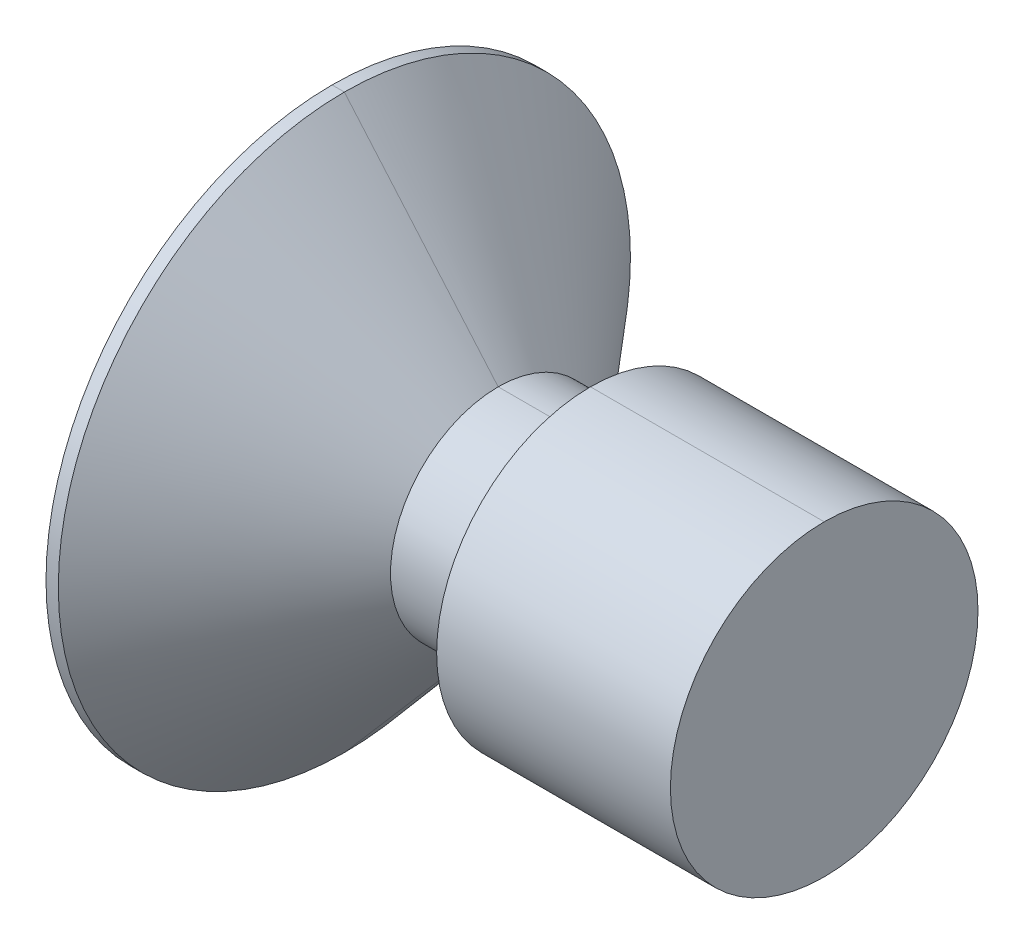
ISO-10303-21;
HEADER;
FILE_DESCRIPTION(('STEP AP214'),'2;1');
FILE_NAME('part.step','',(''),(''),'','','');
FILE_SCHEMA(('AUTOMOTIVE_DESIGN { 1 0 10303 214 1 1 1 1 }'));
ENDSEC;
DATA;
#1=APPLICATION_CONTEXT('core data for automotive mechanical design processes');
#2=APPLICATION_PROTOCOL_DEFINITION('international standard','automotive_design',2000,#1);
#3=PRODUCT_CONTEXT('',#1,'mechanical');
#4=PRODUCT('Part','Part','',(#3));
#5=PRODUCT_RELATED_PRODUCT_CATEGORY('part','',(#4));
#6=PRODUCT_DEFINITION_FORMATION('','',#4);
#7=PRODUCT_DEFINITION_CONTEXT('part definition',#1,'design');
#8=PRODUCT_DEFINITION('design','',#6,#7);
#9=PRODUCT_DEFINITION_SHAPE('','',#8);
#10=(LENGTH_UNIT() NAMED_UNIT(*) SI_UNIT(.MILLI.,.METRE.));
#11=(NAMED_UNIT(*) PLANE_ANGLE_UNIT() SI_UNIT($,.RADIAN.));
#12=(NAMED_UNIT(*) SI_UNIT($,.STERADIAN.) SOLID_ANGLE_UNIT());
#13=UNCERTAINTY_MEASURE_WITH_UNIT(LENGTH_MEASURE(1.E-05),#10,'distance_accuracy_value','');
#14=(GEOMETRIC_REPRESENTATION_CONTEXT(3) GLOBAL_UNCERTAINTY_ASSIGNED_CONTEXT((#13)) GLOBAL_UNIT_ASSIGNED_CONTEXT((#10,
#11,#12)) REPRESENTATION_CONTEXT('',''));
#15=CARTESIAN_POINT('',(0.,0.,0.));
#16=DIRECTION('',(0.,0.,1.));
#17=DIRECTION('',(1.,0.,0.));
#18=AXIS2_PLACEMENT_3D('',#15,#16,#17);
#19=CARTESIAN_POINT('',(-6.65,1.125,-1.125));
#20=DIRECTION('',(1.,0.,0.));
#21=DIRECTION('',(0.,1.,0.));
#22=AXIS2_PLACEMENT_3D('',#19,#20,#21);
#23=PLANE('',#22);
#24=DIRECTION('',(0.,-1.,0.));
#25=VECTOR('',#24,1.);
#26=CARTESIAN_POINT('',(-6.65,3.,-0.625));
#27=LINE('',#26,#25);
#28=CARTESIAN_POINT('',(-6.65,3.,-0.625));
#29=VERTEX_POINT('',#28);
#30=CARTESIAN_POINT('',(-6.65,1.125,-0.625));
#31=VERTEX_POINT('',#30);
#32=EDGE_CURVE('E279',#29,#31,#27,.T.);
#33=ORIENTED_EDGE('',*,*,#32,.T.);
#34=CARTESIAN_POINT('',(-6.65,1.125,-1.125));
#35=DIRECTION('',(1.,0.,0.));
#36=DIRECTION('',(0.,1.,0.));
#37=AXIS2_PLACEMENT_3D('',#34,#35,#36);
#38=CIRCLE('',#37,0.5);
#39=CARTESIAN_POINT('',(-6.65,0.625,-1.125));
#40=VERTEX_POINT('',#39);
#41=EDGE_CURVE('E10',#31,#40,#38,.T.);
#42=ORIENTED_EDGE('',*,*,#41,.T.);
#43=DIRECTION('',(0.,0.,-1.));
#44=VECTOR('',#43,1.);
#45=CARTESIAN_POINT('',(-6.65,0.625,-3.));
#46=LINE('',#45,#44);
#47=CARTESIAN_POINT('',(-6.65,0.625,-3.));
#48=VERTEX_POINT('',#47);
#49=EDGE_CURVE('E246',#40,#48,#46,.T.);
#50=ORIENTED_EDGE('',*,*,#49,.T.);
#51=DIRECTION('',(0.,-1.,0.));
#52=VECTOR('',#51,1.);
#53=CARTESIAN_POINT('',(-6.65,0.625,-3.));
#54=LINE('',#53,#52);
#55=CARTESIAN_POINT('',(-6.65,-0.625,-3.));
#56=VERTEX_POINT('',#55);
#57=EDGE_CURVE('E294',#48,#56,#54,.T.);
#58=ORIENTED_EDGE('',*,*,#57,.T.);
#59=DIRECTION('',(0.,0.,1.));
#60=VECTOR('',#59,1.);
#61=CARTESIAN_POINT('',(-6.65,-0.625,-3.));
#62=LINE('',#61,#60);
#63=CARTESIAN_POINT('',(-6.65,-0.625,-1.125));
#64=VERTEX_POINT('',#63);
#65=EDGE_CURVE('E283',#56,#64,#62,.T.);
#66=ORIENTED_EDGE('',*,*,#65,.T.);
#67=CARTESIAN_POINT('',(-6.65,-1.125,-1.125));
#68=DIRECTION('',(1.,0.,0.));
#69=DIRECTION('',(0.,-1.,0.));
#70=AXIS2_PLACEMENT_3D('',#67,#68,#69);
#71=CIRCLE('',#70,0.5);
#72=CARTESIAN_POINT('',(-6.65,-1.125,-0.625));
#73=VERTEX_POINT('',#72);
#74=EDGE_CURVE('E247',#64,#73,#71,.T.);
#75=ORIENTED_EDGE('',*,*,#74,.T.);
#76=DIRECTION('',(0.,-1.,0.));
#77=VECTOR('',#76,1.);
#78=CARTESIAN_POINT('',(-6.65,-1.125,-0.625));
#79=LINE('',#78,#77);
#80=CARTESIAN_POINT('',(-6.65,-3.,-0.625));
#81=VERTEX_POINT('',#80);
#82=EDGE_CURVE('E20',#73,#81,#79,.T.);
#83=ORIENTED_EDGE('',*,*,#82,.T.);
#84=DIRECTION('',(0.,0.,1.));
#85=VECTOR('',#84,1.);
#86=CARTESIAN_POINT('',(-6.65,-3.,-0.625));
#87=LINE('',#86,#85);
#88=CARTESIAN_POINT('',(-6.65,-3.,0.625));
#89=VERTEX_POINT('',#88);
#90=EDGE_CURVE('E371',#81,#89,#87,.T.);
#91=ORIENTED_EDGE('',*,*,#90,.T.);
#92=DIRECTION('',(0.,1.,0.));
#93=VECTOR('',#92,1.);
#94=CARTESIAN_POINT('',(-6.65,-1.125,0.625));
#95=LINE('',#94,#93);
#96=CARTESIAN_POINT('',(-6.65,-1.125,0.625));
#97=VERTEX_POINT('',#96);
#98=EDGE_CURVE('E313',#89,#97,#95,.T.);
#99=ORIENTED_EDGE('',*,*,#98,.T.);
#100=CARTESIAN_POINT('',(-6.65,-1.125,1.125));
#101=DIRECTION('',(1.,0.,0.));
#102=DIRECTION('',(0.,1.,0.));
#103=AXIS2_PLACEMENT_3D('',#100,#101,#102);
#104=CIRCLE('',#103,0.5);
#105=CARTESIAN_POINT('',(-6.65,-0.625,1.125));
#106=VERTEX_POINT('',#105);
#107=EDGE_CURVE('E254',#97,#106,#104,.T.);
#108=ORIENTED_EDGE('',*,*,#107,.T.);
#109=DIRECTION('',(0.,0.,1.));
#110=VECTOR('',#109,1.);
#111=CARTESIAN_POINT('',(-6.65,-0.625,1.125));
#112=LINE('',#111,#110);
#113=CARTESIAN_POINT('',(-6.65,-0.625,3.));
#114=VERTEX_POINT('',#113);
#115=EDGE_CURVE('E328',#106,#114,#112,.T.);
#116=ORIENTED_EDGE('',*,*,#115,.T.);
#117=DIRECTION('',(0.,1.,0.));
#118=VECTOR('',#117,1.);
#119=CARTESIAN_POINT('',(-6.65,0.625,3.));
#120=LINE('',#119,#118);
#121=CARTESIAN_POINT('',(-6.65,0.625,3.));
#122=VERTEX_POINT('',#121);
#123=EDGE_CURVE('E264',#114,#122,#120,.T.);
#124=ORIENTED_EDGE('',*,*,#123,.T.);
#125=DIRECTION('',(0.,0.,-1.));
#126=VECTOR('',#125,1.);
#127=CARTESIAN_POINT('',(-6.65,0.625,1.125));
#128=LINE('',#127,#126);
#129=CARTESIAN_POINT('',(-6.65,0.625,1.125));
#130=VERTEX_POINT('',#129);
#131=EDGE_CURVE('E226',#122,#130,#128,.T.);
#132=ORIENTED_EDGE('',*,*,#131,.T.);
#133=CARTESIAN_POINT('',(-6.65,1.125,1.125));
#134=DIRECTION('',(1.,0.,0.));
#135=DIRECTION('',(0.,1.,0.));
#136=AXIS2_PLACEMENT_3D('',#133,#134,#135);
#137=CIRCLE('',#136,0.5);
#138=CARTESIAN_POINT('',(-6.65,1.125,0.625));
#139=VERTEX_POINT('',#138);
#140=EDGE_CURVE('E227',#130,#139,#137,.T.);
#141=ORIENTED_EDGE('',*,*,#140,.T.);
#142=DIRECTION('',(0.,1.,0.));
#143=VECTOR('',#142,1.);
#144=CARTESIAN_POINT('',(-6.65,3.,0.625));
#145=LINE('',#144,#143);
#146=CARTESIAN_POINT('',(-6.65,3.,0.625));
#147=VERTEX_POINT('',#146);
#148=EDGE_CURVE('E344',#139,#147,#145,.T.);
#149=ORIENTED_EDGE('',*,*,#148,.T.);
#150=DIRECTION('',(0.,0.,-1.));
#151=VECTOR('',#150,1.);
#152=CARTESIAN_POINT('',(-6.65,3.,-0.625));
#153=LINE('',#152,#151);
#154=EDGE_CURVE('E278',#147,#29,#153,.T.);
#155=ORIENTED_EDGE('',*,*,#154,.T.);
#156=EDGE_LOOP('',(#33,#42,#50,#58,#66,#75,#83,#91,#99,#108,#116,#124,#132,#141,#149,#155));
#157=FACE_BOUND('',#156,.T.);
#158=ADVANCED_FACE('F16',(#157),#23,.F.);
#159=CARTESIAN_POINT('',(-6.65,1.125,-1.125));
#160=DIRECTION('',(-1.,0.,0.));
#161=DIRECTION('',(0.,-1.,0.));
#162=AXIS2_PLACEMENT_3D('',#159,#160,#161);
#163=CYLINDRICAL_SURFACE('',#162,0.5);
#164=CARTESIAN_POINT('',(-8.,1.125,-1.125));
#165=DIRECTION('',(1.,0.,0.));
#166=DIRECTION('',(0.,1.,0.));
#167=AXIS2_PLACEMENT_3D('',#164,#165,#166);
#168=CIRCLE('',#167,0.5);
#169=CARTESIAN_POINT('',(-8.,1.125,-0.625));
#170=VERTEX_POINT('',#169);
#171=CARTESIAN_POINT('',(-8.,0.625,-1.125));
#172=VERTEX_POINT('',#171);
#173=EDGE_CURVE('E389',#170,#172,#168,.T.);
#174=ORIENTED_EDGE('',*,*,#173,.T.);
#175=DIRECTION('',(-1.,0.,0.));
#176=VECTOR('',#175,1.);
#177=CARTESIAN_POINT('',(-6.65,0.625,-1.125));
#178=LINE('',#177,#176);
#179=EDGE_CURVE('E27',#40,#172,#178,.T.);
#180=ORIENTED_EDGE('',*,*,#179,.F.);
#181=ORIENTED_EDGE('',*,*,#41,.F.);
#182=DIRECTION('',(-1.,0.,0.));
#183=VECTOR('',#182,1.);
#184=CARTESIAN_POINT('',(-6.65,1.125,-0.625));
#185=LINE('',#184,#183);
#186=EDGE_CURVE('E393',#31,#170,#185,.T.);
#187=ORIENTED_EDGE('',*,*,#186,.T.);
#188=EDGE_LOOP('',(#174,#180,#181,#187));
#189=FACE_BOUND('',#188,.T.);
#190=ADVANCED_FACE('F509',(#189),#163,.T.);
#191=CARTESIAN_POINT('',(-6.65,0.625,-3.));
#192=DIRECTION('',(0.,1.,0.));
#193=DIRECTION('',(1.,0.,0.));
#194=AXIS2_PLACEMENT_3D('',#191,#192,#193);
#195=PLANE('',#194);
#196=DIRECTION('',(0.,0.,-1.));
#197=VECTOR('',#196,1.);
#198=CARTESIAN_POINT('',(-8.,0.625,-3.));
#199=LINE('',#198,#197);
#200=CARTESIAN_POINT('',(-8.,0.625,-3.));
#201=VERTEX_POINT('',#200);
#202=EDGE_CURVE('E385',#172,#201,#199,.T.);
#203=ORIENTED_EDGE('',*,*,#202,.T.);
#204=DIRECTION('',(-1.,0.,0.));
#205=VECTOR('',#204,1.);
#206=CARTESIAN_POINT('',(-6.65,0.625,-3.));
#207=LINE('',#206,#205);
#208=EDGE_CURVE('E291',#48,#201,#207,.T.);
#209=ORIENTED_EDGE('',*,*,#208,.F.);
#210=ORIENTED_EDGE('',*,*,#49,.F.);
#211=ORIENTED_EDGE('',*,*,#179,.T.);
#212=EDGE_LOOP('',(#203,#209,#210,#211));
#213=FACE_BOUND('',#212,.T.);
#214=ADVANCED_FACE('F437',(#213),#195,.F.);
#215=CARTESIAN_POINT('',(-6.65,0.625,-3.));
#216=DIRECTION('',(0.,0.,-1.));
#217=DIRECTION('',(-1.,0.,0.));
#218=AXIS2_PLACEMENT_3D('',#215,#216,#217);
#219=PLANE('',#218);
#220=DIRECTION('',(0.,-1.,0.));
#221=VECTOR('',#220,1.);
#222=CARTESIAN_POINT('',(-8.,0.625,-3.));
#223=LINE('',#222,#221);
#224=CARTESIAN_POINT('',(-8.,-0.625,-3.));
#225=VERTEX_POINT('',#224);
#226=EDGE_CURVE('E335',#201,#225,#223,.T.);
#227=ORIENTED_EDGE('',*,*,#226,.T.);
#228=DIRECTION('',(-1.,0.,0.));
#229=VECTOR('',#228,1.);
#230=CARTESIAN_POINT('',(-6.65,-0.625,-3.));
#231=LINE('',#230,#229);
#232=EDGE_CURVE('E286',#56,#225,#231,.T.);
#233=ORIENTED_EDGE('',*,*,#232,.F.);
#234=ORIENTED_EDGE('',*,*,#57,.F.);
#235=ORIENTED_EDGE('',*,*,#208,.T.);
#236=EDGE_LOOP('',(#227,#233,#234,#235));
#237=FACE_BOUND('',#236,.T.);
#238=ADVANCED_FACE('F451',(#237),#219,.F.);
#239=CARTESIAN_POINT('',(-6.65,-0.625,-3.));
#240=DIRECTION('',(0.,-1.,0.));
#241=DIRECTION('',(0.,0.,-1.));
#242=AXIS2_PLACEMENT_3D('',#239,#240,#241);
#243=PLANE('',#242);
#244=DIRECTION('',(0.,0.,1.));
#245=VECTOR('',#244,1.);
#246=CARTESIAN_POINT('',(-8.,-0.625,-3.));
#247=LINE('',#246,#245);
#248=CARTESIAN_POINT('',(-8.,-0.625,-1.125));
#249=VERTEX_POINT('',#248);
#250=EDGE_CURVE('E324',#225,#249,#247,.T.);
#251=ORIENTED_EDGE('',*,*,#250,.T.);
#252=DIRECTION('',(-1.,0.,0.));
#253=VECTOR('',#252,1.);
#254=CARTESIAN_POINT('',(-6.65,-0.625,-1.125));
#255=LINE('',#254,#253);
#256=EDGE_CURVE('E250',#64,#249,#255,.T.);
#257=ORIENTED_EDGE('',*,*,#256,.F.);
#258=ORIENTED_EDGE('',*,*,#65,.F.);
#259=ORIENTED_EDGE('',*,*,#232,.T.);
#260=EDGE_LOOP('',(#251,#257,#258,#259));
#261=FACE_BOUND('',#260,.T.);
#262=ADVANCED_FACE('F591',(#261),#243,.F.);
#263=CARTESIAN_POINT('',(-6.65,-1.125,-1.125));
#264=DIRECTION('',(-1.,0.,0.));
#265=DIRECTION('',(0.,-1.,0.));
#266=AXIS2_PLACEMENT_3D('',#263,#264,#265);
#267=CYLINDRICAL_SURFACE('',#266,0.5);
#268=CARTESIAN_POINT('',(-8.,-1.125,-1.125));
#269=DIRECTION('',(1.,0.,0.));
#270=DIRECTION('',(0.,-1.,0.));
#271=AXIS2_PLACEMENT_3D('',#268,#269,#270);
#272=CIRCLE('',#271,0.5);
#273=CARTESIAN_POINT('',(-8.,-1.125,-0.625));
#274=VERTEX_POINT('',#273);
#275=EDGE_CURVE('E320',#249,#274,#272,.T.);
#276=ORIENTED_EDGE('',*,*,#275,.T.);
#277=DIRECTION('',(-1.,0.,0.));
#278=VECTOR('',#277,1.);
#279=CARTESIAN_POINT('',(-6.65,-1.125,-0.625));
#280=LINE('',#279,#278);
#281=EDGE_CURVE('E251',#73,#274,#280,.T.);
#282=ORIENTED_EDGE('',*,*,#281,.F.);
#283=ORIENTED_EDGE('',*,*,#74,.F.);
#284=ORIENTED_EDGE('',*,*,#256,.T.);
#285=EDGE_LOOP('',(#276,#282,#283,#284));
#286=FACE_BOUND('',#285,.T.);
#287=ADVANCED_FACE('F539',(#286),#267,.T.);
#288=CARTESIAN_POINT('',(-6.65,-1.125,-0.625));
#289=DIRECTION('',(0.,0.,-1.));
#290=DIRECTION('',(0.,-1.,0.));
#291=AXIS2_PLACEMENT_3D('',#288,#289,#290);
#292=PLANE('',#291);
#293=DIRECTION('',(0.,-1.,0.));
#294=VECTOR('',#293,1.);
#295=CARTESIAN_POINT('',(-8.,-1.125,-0.625));
#296=LINE('',#295,#294);
#297=CARTESIAN_POINT('',(-8.,-3.,-0.625));
#298=VERTEX_POINT('',#297);
#299=EDGE_CURVE('E305',#274,#298,#296,.T.);
#300=ORIENTED_EDGE('',*,*,#299,.T.);
#301=DIRECTION('',(-1.,0.,0.));
#302=VECTOR('',#301,1.);
#303=CARTESIAN_POINT('',(-6.65,-3.,-0.625));
#304=LINE('',#303,#302);
#305=EDGE_CURVE('E375',#81,#298,#304,.T.);
#306=ORIENTED_EDGE('',*,*,#305,.F.);
#307=ORIENTED_EDGE('',*,*,#82,.F.);
#308=ORIENTED_EDGE('',*,*,#281,.T.);
#309=EDGE_LOOP('',(#300,#306,#307,#308));
#310=FACE_BOUND('',#309,.T.);
#311=ADVANCED_FACE('F537',(#310),#292,.F.);
#312=CARTESIAN_POINT('',(-6.65,-3.,-0.625));
#313=DIRECTION('',(0.,-1.,0.));
#314=DIRECTION('',(0.,0.,-1.));
#315=AXIS2_PLACEMENT_3D('',#312,#313,#314);
#316=PLANE('',#315);
#317=DIRECTION('',(0.,0.,1.));
#318=VECTOR('',#317,1.);
#319=CARTESIAN_POINT('',(-8.,-3.,-0.625));
#320=LINE('',#319,#318);
#321=CARTESIAN_POINT('',(-8.,-3.,0.625));
#322=VERTEX_POINT('',#321);
#323=EDGE_CURVE('E301',#298,#322,#320,.T.);
#324=ORIENTED_EDGE('',*,*,#323,.T.);
#325=DIRECTION('',(-1.,0.,0.));
#326=VECTOR('',#325,1.);
#327=CARTESIAN_POINT('',(-6.65,-3.,0.625));
#328=LINE('',#327,#326);
#329=EDGE_CURVE('E316',#89,#322,#328,.T.);
#330=ORIENTED_EDGE('',*,*,#329,.F.);
#331=ORIENTED_EDGE('',*,*,#90,.F.);
#332=ORIENTED_EDGE('',*,*,#305,.T.);
#333=EDGE_LOOP('',(#324,#330,#331,#332));
#334=FACE_BOUND('',#333,.T.);
#335=ADVANCED_FACE('F533',(#334),#316,.F.);
#336=CARTESIAN_POINT('',(-6.65,-1.125,0.625));
#337=DIRECTION('',(0.,0.,1.));
#338=DIRECTION('',(0.,-1.,0.));
#339=AXIS2_PLACEMENT_3D('',#336,#337,#338);
#340=PLANE('',#339);
#341=DIRECTION('',(0.,1.,0.));
#342=VECTOR('',#341,1.);
#343=CARTESIAN_POINT('',(-8.,-1.125,0.625));
#344=LINE('',#343,#342);
#345=CARTESIAN_POINT('',(-8.,-1.125,0.625));
#346=VERTEX_POINT('',#345);
#347=EDGE_CURVE('E240',#322,#346,#344,.T.);
#348=ORIENTED_EDGE('',*,*,#347,.T.);
#349=DIRECTION('',(-1.,0.,0.));
#350=VECTOR('',#349,1.);
#351=CARTESIAN_POINT('',(-6.65,-1.125,0.625));
#352=LINE('',#351,#350);
#353=EDGE_CURVE('E257',#97,#346,#352,.T.);
#354=ORIENTED_EDGE('',*,*,#353,.F.);
#355=ORIENTED_EDGE('',*,*,#98,.F.);
#356=ORIENTED_EDGE('',*,*,#329,.T.);
#357=EDGE_LOOP('',(#348,#354,#355,#356));
#358=FACE_BOUND('',#357,.T.);
#359=ADVANCED_FACE('F528',(#358),#340,.F.);
#360=CARTESIAN_POINT('',(-6.65,-1.125,1.125));
#361=DIRECTION('',(-1.,0.,0.));
#362=DIRECTION('',(0.,-1.,0.));
#363=AXIS2_PLACEMENT_3D('',#360,#361,#362);
#364=CYLINDRICAL_SURFACE('',#363,0.5);
#365=CARTESIAN_POINT('',(-8.,-1.125,1.125));
#366=DIRECTION('',(1.,0.,0.));
#367=DIRECTION('',(0.,1.,0.));
#368=AXIS2_PLACEMENT_3D('',#365,#366,#367);
#369=CIRCLE('',#368,0.5);
#370=CARTESIAN_POINT('',(-8.,-0.625,1.125));
#371=VERTEX_POINT('',#370);
#372=EDGE_CURVE('E237',#346,#371,#369,.T.);
#373=ORIENTED_EDGE('',*,*,#372,.T.);
#374=DIRECTION('',(-1.,0.,0.));
#375=VECTOR('',#374,1.);
#376=CARTESIAN_POINT('',(-6.65,-0.625,1.125));
#377=LINE('',#376,#375);
#378=EDGE_CURVE('E258',#106,#371,#377,.T.);
#379=ORIENTED_EDGE('',*,*,#378,.F.);
#380=ORIENTED_EDGE('',*,*,#107,.F.);
#381=ORIENTED_EDGE('',*,*,#353,.T.);
#382=EDGE_LOOP('',(#373,#379,#380,#381));
#383=FACE_BOUND('',#382,.T.);
#384=ADVANCED_FACE('F522',(#383),#364,.T.);
#385=CARTESIAN_POINT('',(-6.65,-0.625,1.125));
#386=DIRECTION('',(0.,-1.,0.));
#387=DIRECTION('',(0.,0.,-1.));
#388=AXIS2_PLACEMENT_3D('',#385,#386,#387);
#389=PLANE('',#388);
#390=DIRECTION('',(0.,0.,1.));
#391=VECTOR('',#390,1.);
#392=CARTESIAN_POINT('',(-8.,-0.625,1.125));
#393=LINE('',#392,#391);
#394=CARTESIAN_POINT('',(-8.,-0.625,3.));
#395=VERTEX_POINT('',#394);
#396=EDGE_CURVE('E241',#371,#395,#393,.T.);
#397=ORIENTED_EDGE('',*,*,#396,.T.);
#398=DIRECTION('',(-1.,0.,0.));
#399=VECTOR('',#398,1.);
#400=CARTESIAN_POINT('',(-6.65,-0.625,3.));
#401=LINE('',#400,#399);
#402=EDGE_CURVE('E267',#114,#395,#401,.T.);
#403=ORIENTED_EDGE('',*,*,#402,.F.);
#404=ORIENTED_EDGE('',*,*,#115,.F.);
#405=ORIENTED_EDGE('',*,*,#378,.T.);
#406=EDGE_LOOP('',(#397,#403,#404,#405));
#407=FACE_BOUND('',#406,.T.);
#408=ADVANCED_FACE('F518',(#407),#389,.F.);
#409=CARTESIAN_POINT('',(-6.65,0.625,3.));
#410=DIRECTION('',(0.,0.,1.));
#411=DIRECTION('',(1.,0.,0.));
#412=AXIS2_PLACEMENT_3D('',#409,#410,#411);
#413=PLANE('',#412);
#414=DIRECTION('',(0.,1.,0.));
#415=VECTOR('',#414,1.);
#416=CARTESIAN_POINT('',(-8.,0.625,3.));
#417=LINE('',#416,#415);
#418=CARTESIAN_POINT('',(-8.,0.625,3.));
#419=VERTEX_POINT('',#418);
#420=EDGE_CURVE('E296',#395,#419,#417,.T.);
#421=ORIENTED_EDGE('',*,*,#420,.T.);
#422=DIRECTION('',(-1.,0.,0.));
#423=VECTOR('',#422,1.);
#424=CARTESIAN_POINT('',(-6.65,0.625,3.));
#425=LINE('',#424,#423);
#426=EDGE_CURVE('E268',#122,#419,#425,.T.);
#427=ORIENTED_EDGE('',*,*,#426,.F.);
#428=ORIENTED_EDGE('',*,*,#123,.F.);
#429=ORIENTED_EDGE('',*,*,#402,.T.);
#430=EDGE_LOOP('',(#421,#427,#428,#429));
#431=FACE_BOUND('',#430,.T.);
#432=ADVANCED_FACE('F514',(#431),#413,.F.);
#433=CARTESIAN_POINT('',(-6.65,0.625,1.125));
#434=DIRECTION('',(0.,1.,0.));
#435=DIRECTION('',(0.,0.,-1.));
#436=AXIS2_PLACEMENT_3D('',#433,#434,#435);
#437=PLANE('',#436);
#438=DIRECTION('',(0.,0.,-1.));
#439=VECTOR('',#438,1.);
#440=CARTESIAN_POINT('',(-8.,0.625,1.125));
#441=LINE('',#440,#439);
#442=CARTESIAN_POINT('',(-8.,0.625,1.125));
#443=VERTEX_POINT('',#442);
#444=EDGE_CURVE('E300',#419,#443,#441,.T.);
#445=ORIENTED_EDGE('',*,*,#444,.T.);
#446=DIRECTION('',(-1.,0.,0.));
#447=VECTOR('',#446,1.);
#448=CARTESIAN_POINT('',(-6.65,0.625,1.125));
#449=LINE('',#448,#447);
#450=EDGE_CURVE('E224',#130,#443,#449,.T.);
#451=ORIENTED_EDGE('',*,*,#450,.F.);
#452=ORIENTED_EDGE('',*,*,#131,.F.);
#453=ORIENTED_EDGE('',*,*,#426,.T.);
#454=EDGE_LOOP('',(#445,#451,#452,#453));
#455=FACE_BOUND('',#454,.T.);
#456=ADVANCED_FACE('F490',(#455),#437,.F.);
#457=CARTESIAN_POINT('',(-6.65,1.125,1.125));
#458=DIRECTION('',(-1.,0.,0.));
#459=DIRECTION('',(0.,-1.,0.));
#460=AXIS2_PLACEMENT_3D('',#457,#458,#459);
#461=CYLINDRICAL_SURFACE('',#460,0.5);
#462=CARTESIAN_POINT('',(-8.,1.125,1.125));
#463=DIRECTION('',(1.,0.,0.));
#464=DIRECTION('',(0.,1.,0.));
#465=AXIS2_PLACEMENT_3D('',#462,#463,#464);
#466=CIRCLE('',#465,0.5);
#467=CARTESIAN_POINT('',(-8.,1.125,0.625));
#468=VERTEX_POINT('',#467);
#469=EDGE_CURVE('E235',#443,#468,#466,.T.);
#470=ORIENTED_EDGE('',*,*,#469,.T.);
#471=DIRECTION('',(-1.,0.,0.));
#472=VECTOR('',#471,1.);
#473=CARTESIAN_POINT('',(-6.65,1.125,0.625));
#474=LINE('',#473,#472);
#475=EDGE_CURVE('E282',#139,#468,#474,.T.);
#476=ORIENTED_EDGE('',*,*,#475,.F.);
#477=ORIENTED_EDGE('',*,*,#140,.F.);
#478=ORIENTED_EDGE('',*,*,#450,.T.);
#479=EDGE_LOOP('',(#470,#476,#477,#478));
#480=FACE_BOUND('',#479,.T.);
#481=ADVANCED_FACE('F494',(#480),#461,.T.);
#482=CARTESIAN_POINT('',(-6.65,3.,0.625));
#483=DIRECTION('',(0.,0.,1.));
#484=DIRECTION('',(0.,-1.,0.));
#485=AXIS2_PLACEMENT_3D('',#482,#483,#484);
#486=PLANE('',#485);
#487=DIRECTION('',(0.,1.,0.));
#488=VECTOR('',#487,1.);
#489=CARTESIAN_POINT('',(-8.,3.,0.625));
#490=LINE('',#489,#488);
#491=CARTESIAN_POINT('',(-8.,3.,0.625));
#492=VERTEX_POINT('',#491);
#493=EDGE_CURVE('E231',#468,#492,#490,.T.);
#494=ORIENTED_EDGE('',*,*,#493,.T.);
#495=DIRECTION('',(-1.,0.,0.));
#496=VECTOR('',#495,1.);
#497=CARTESIAN_POINT('',(-6.65,3.,0.625));
#498=LINE('',#497,#496);
#499=EDGE_CURVE('E368',#147,#492,#498,.T.);
#500=ORIENTED_EDGE('',*,*,#499,.F.);
#501=ORIENTED_EDGE('',*,*,#148,.F.);
#502=ORIENTED_EDGE('',*,*,#475,.T.);
#503=EDGE_LOOP('',(#494,#500,#501,#502));
#504=FACE_BOUND('',#503,.T.);
#505=ADVANCED_FACE('F499',(#504),#486,.F.);
#506=CARTESIAN_POINT('',(-6.65,3.,-0.625));
#507=DIRECTION('',(0.,1.,0.));
#508=DIRECTION('',(1.,0.,0.));
#509=AXIS2_PLACEMENT_3D('',#506,#507,#508);
#510=PLANE('',#509);
#511=DIRECTION('',(0.,0.,-1.));
#512=VECTOR('',#511,1.);
#513=CARTESIAN_POINT('',(-8.,3.,-0.625));
#514=LINE('',#513,#512);
#515=CARTESIAN_POINT('',(-8.,3.,-0.625));
#516=VERTEX_POINT('',#515);
#517=EDGE_CURVE('E236',#492,#516,#514,.T.);
#518=ORIENTED_EDGE('',*,*,#517,.T.);
#519=DIRECTION('',(-1.,0.,0.));
#520=VECTOR('',#519,1.);
#521=CARTESIAN_POINT('',(-6.65,3.,-0.625));
#522=LINE('',#521,#520);
#523=EDGE_CURVE('E275',#29,#516,#522,.T.);
#524=ORIENTED_EDGE('',*,*,#523,.F.);
#525=ORIENTED_EDGE('',*,*,#154,.F.);
#526=ORIENTED_EDGE('',*,*,#499,.T.);
#527=EDGE_LOOP('',(#518,#524,#525,#526));
#528=FACE_BOUND('',#527,.T.);
#529=ADVANCED_FACE('F505',(#528),#510,.F.);
#530=CARTESIAN_POINT('',(-6.65,3.,-0.625));
#531=DIRECTION('',(0.,0.,-1.));
#532=DIRECTION('',(0.,-1.,0.));
#533=AXIS2_PLACEMENT_3D('',#530,#531,#532);
#534=PLANE('',#533);
#535=DIRECTION('',(0.,-1.,0.));
#536=VECTOR('',#535,1.);
#537=CARTESIAN_POINT('',(-8.,3.,-0.625));
#538=LINE('',#537,#536);
#539=EDGE_CURVE('E341',#516,#170,#538,.T.);
#540=ORIENTED_EDGE('',*,*,#539,.T.);
#541=ORIENTED_EDGE('',*,*,#186,.F.);
#542=ORIENTED_EDGE('',*,*,#32,.F.);
#543=ORIENTED_EDGE('',*,*,#523,.T.);
#544=EDGE_LOOP('',(#540,#541,#542,#543));
#545=FACE_BOUND('',#544,.T.);
#546=ADVANCED_FACE('F18',(#545),#534,.F.);
#547=CARTESIAN_POINT('',(-8.,4.65,0.));
#548=DIRECTION('',(-1.,0.,0.));
#549=DIRECTION('',(0.,1.,0.));
#550=AXIS2_PLACEMENT_3D('',#547,#548,#549);
#551=PLANE('',#550);
#552=ORIENTED_EDGE('',*,*,#539,.F.);
#553=ORIENTED_EDGE('',*,*,#517,.F.);
#554=ORIENTED_EDGE('',*,*,#493,.F.);
#555=ORIENTED_EDGE('',*,*,#469,.F.);
#556=ORIENTED_EDGE('',*,*,#444,.F.);
#557=ORIENTED_EDGE('',*,*,#420,.F.);
#558=ORIENTED_EDGE('',*,*,#396,.F.);
#559=ORIENTED_EDGE('',*,*,#372,.F.);
#560=ORIENTED_EDGE('',*,*,#347,.F.);
#561=ORIENTED_EDGE('',*,*,#323,.F.);
#562=ORIENTED_EDGE('',*,*,#299,.F.);
#563=ORIENTED_EDGE('',*,*,#275,.F.);
#564=ORIENTED_EDGE('',*,*,#250,.F.);
#565=ORIENTED_EDGE('',*,*,#226,.F.);
#566=ORIENTED_EDGE('',*,*,#202,.F.);
#567=ORIENTED_EDGE('',*,*,#173,.F.);
#568=EDGE_LOOP('',(#552,#553,#554,#555,#556,#557,#558,#559,#560,#561,#562,#563,#564,#565,#566,#567));
#569=FACE_BOUND('',#568,.T.);
#570=CARTESIAN_POINT('',(-8.,0.,0.));
#571=DIRECTION('',(1.,0.,0.));
#572=DIRECTION('',(0.,1.,0.));
#573=AXIS2_PLACEMENT_3D('',#570,#571,#572);
#574=CIRCLE('',#573,4.65);
#575=CARTESIAN_POINT('',(-8.,4.65,0.));
#576=VERTEX_POINT('',#575);
#577=CARTESIAN_POINT('',(-8.,-4.65,0.));
#578=VERTEX_POINT('',#577);
#579=EDGE_CURVE('E259',#576,#578,#574,.T.);
#580=ORIENTED_EDGE('',*,*,#579,.F.);
#581=CARTESIAN_POINT('',(-8.,0.,0.));
#582=DIRECTION('',(1.,0.,0.));
#583=DIRECTION('',(0.,1.,0.));
#584=AXIS2_PLACEMENT_3D('',#581,#582,#583);
#585=CIRCLE('',#584,4.65);
#586=EDGE_CURVE('E230',#578,#576,#585,.T.);
#587=ORIENTED_EDGE('',*,*,#586,.F.);
#588=EDGE_LOOP('',(#580,#587));
#589=FACE_BOUND('',#588,.T.);
#590=ADVANCED_FACE('F446',(#569,#589),#551,.T.);
#591=CARTESIAN_POINT('',(0.,0.,0.));
#592=DIRECTION('',(1.,0.,0.));
#593=DIRECTION('',(0.,1.,0.));
#594=AXIS2_PLACEMENT_3D('',#591,#592,#593);
#595=CYLINDRICAL_SURFACE('',#594,4.65);
#596=DIRECTION('',(1.,0.,0.));
#597=VECTOR('',#596,1.);
#598=CARTESIAN_POINT('',(0.,-4.65,0.));
#599=LINE('',#598,#597);
#600=CARTESIAN_POINT('',(-7.8,-4.65,0.));
#601=VERTEX_POINT('',#600);
#602=EDGE_CURVE('E262',#578,#601,#599,.T.);
#603=ORIENTED_EDGE('',*,*,#602,.F.);
#604=ORIENTED_EDGE('',*,*,#586,.T.);
#605=DIRECTION('',(1.,0.,0.));
#606=VECTOR('',#605,1.);
#607=CARTESIAN_POINT('',(0.,4.65,0.));
#608=LINE('',#607,#606);
#609=CARTESIAN_POINT('',(-7.8,4.65,0.));
#610=VERTEX_POINT('',#609);
#611=EDGE_CURVE('E215',#576,#610,#608,.T.);
#612=ORIENTED_EDGE('',*,*,#611,.T.);
#613=CARTESIAN_POINT('',(-7.8,0.,0.));
#614=DIRECTION('',(1.,0.,0.));
#615=DIRECTION('',(0.,1.,0.));
#616=AXIS2_PLACEMENT_3D('',#613,#614,#615);
#617=CIRCLE('',#616,4.65);
#618=EDGE_CURVE('E191',#601,#610,#617,.T.);
#619=ORIENTED_EDGE('',*,*,#618,.F.);
#620=EDGE_LOOP('',(#603,#604,#612,#619));
#621=FACE_BOUND('',#620,.T.);
#622=ADVANCED_FACE('F565',(#621),#595,.T.);
#623=CARTESIAN_POINT('',(-5.3,0.,0.));
#624=DIRECTION('',(-1.,0.,0.));
#625=DIRECTION('',(0.,-1.,0.));
#626=AXIS2_PLACEMENT_3D('',#623,#624,#625);
#627=CONICAL_SURFACE('',#626,1.75,0.859337201055389);
#628=DIRECTION('',(-0.652939622069463,0.757409961600577,0.));
#629=VECTOR('',#628,1.);
#630=CARTESIAN_POINT('',(-5.3,1.75,0.));
#631=LINE('',#630,#629);
#632=CARTESIAN_POINT('',(-5.3,1.75,0.));
#633=VERTEX_POINT('',#632);
#634=EDGE_CURVE('E205',#633,#610,#631,.T.);
#635=ORIENTED_EDGE('',*,*,#634,.F.);
#636=CARTESIAN_POINT('',(-5.3,0.,0.));
#637=DIRECTION('',(1.,0.,0.));
#638=DIRECTION('',(0.,1.,0.));
#639=AXIS2_PLACEMENT_3D('',#636,#637,#638);
#640=CIRCLE('',#639,1.75);
#641=CARTESIAN_POINT('',(-5.3,-1.75,0.));
#642=VERTEX_POINT('',#641);
#643=EDGE_CURVE('E178',#642,#633,#640,.T.);
#644=ORIENTED_EDGE('',*,*,#643,.F.);
#645=DIRECTION('',(-0.652939622069463,-0.757409961600577,0.));
#646=VECTOR('',#645,1.);
#647=CARTESIAN_POINT('',(-5.3,-1.75,0.));
#648=LINE('',#647,#646);
#649=EDGE_CURVE('E211',#642,#601,#648,.T.);
#650=ORIENTED_EDGE('',*,*,#649,.T.);
#651=ORIENTED_EDGE('',*,*,#618,.T.);
#652=EDGE_LOOP('',(#635,#644,#650,#651));
#653=FACE_BOUND('',#652,.T.);
#654=ADVANCED_FACE('F206',(#653),#627,.T.);
#655=CARTESIAN_POINT('',(0.,0.,0.));
#656=DIRECTION('',(1.,0.,0.));
#657=DIRECTION('',(0.,1.,0.));
#658=AXIS2_PLACEMENT_3D('',#655,#656,#657);
#659=CYLINDRICAL_SURFACE('',#658,1.75);
#660=DIRECTION('',(1.,0.,0.));
#661=VECTOR('',#660,1.);
#662=CARTESIAN_POINT('',(0.,-1.75,0.));
#663=LINE('',#662,#661);
#664=CARTESIAN_POINT('',(-3.8,-1.75,0.));
#665=VERTEX_POINT('',#664);
#666=EDGE_CURVE('E185',#642,#665,#663,.T.);
#667=ORIENTED_EDGE('',*,*,#666,.F.);
#668=ORIENTED_EDGE('',*,*,#643,.T.);
#669=DIRECTION('',(1.,0.,0.));
#670=VECTOR('',#669,1.);
#671=CARTESIAN_POINT('',(0.,1.75,0.));
#672=LINE('',#671,#670);
#673=CARTESIAN_POINT('',(-3.8,1.75,0.));
#674=VERTEX_POINT('',#673);
#675=EDGE_CURVE('E182',#633,#674,#672,.T.);
#676=ORIENTED_EDGE('',*,*,#675,.T.);
#677=CARTESIAN_POINT('',(-3.8,0.,0.));
#678=DIRECTION('',(1.,0.,0.));
#679=DIRECTION('',(0.,1.,0.));
#680=AXIS2_PLACEMENT_3D('',#677,#678,#679);
#681=CIRCLE('',#680,1.75);
#682=EDGE_CURVE('E192',#665,#674,#681,.T.);
#683=ORIENTED_EDGE('',*,*,#682,.F.);
#684=EDGE_LOOP('',(#667,#668,#676,#683));
#685=FACE_BOUND('',#684,.T.);
#686=ADVANCED_FACE('F180',(#685),#659,.T.);
#687=CARTESIAN_POINT('',(-3.8,2.5,0.));
#688=DIRECTION('',(-1.,0.,0.));
#689=DIRECTION('',(0.,1.,0.));
#690=AXIS2_PLACEMENT_3D('',#687,#688,#689);
#691=PLANE('',#690);
#692=CARTESIAN_POINT('',(-3.8,0.,0.));
#693=DIRECTION('',(1.,0.,0.));
#694=DIRECTION('',(0.,1.,0.));
#695=AXIS2_PLACEMENT_3D('',#692,#693,#694);
#696=CIRCLE('',#695,1.75);
#697=EDGE_CURVE('E200',#674,#665,#696,.T.);
#698=ORIENTED_EDGE('',*,*,#697,.T.);
#699=ORIENTED_EDGE('',*,*,#682,.T.);
#700=EDGE_LOOP('',(#698,#699));
#701=FACE_BOUND('',#700,.T.);
#702=CARTESIAN_POINT('',(-3.8,0.,0.));
#703=DIRECTION('',(1.,0.,0.));
#704=DIRECTION('',(0.,1.,0.));
#705=AXIS2_PLACEMENT_3D('',#702,#703,#704);
#706=CIRCLE('',#705,2.5);
#707=CARTESIAN_POINT('',(-3.8,2.5,0.));
#708=VERTEX_POINT('',#707);
#709=CARTESIAN_POINT('',(-3.8,-2.5,0.));
#710=VERTEX_POINT('',#709);
#711=EDGE_CURVE('E202',#708,#710,#706,.T.);
#712=ORIENTED_EDGE('',*,*,#711,.F.);
#713=CARTESIAN_POINT('',(-3.8,0.,0.));
#714=DIRECTION('',(1.,0.,0.));
#715=DIRECTION('',(0.,1.,0.));
#716=AXIS2_PLACEMENT_3D('',#713,#714,#715);
#717=CIRCLE('',#716,2.5);
#718=EDGE_CURVE('E290',#710,#708,#717,.T.);
#719=ORIENTED_EDGE('',*,*,#718,.F.);
#720=EDGE_LOOP('',(#712,#719));
#721=FACE_BOUND('',#720,.T.);
#722=ADVANCED_FACE('F638',(#701,#721),#691,.T.);
#723=CARTESIAN_POINT('',(0.,0.,0.));
#724=DIRECTION('',(1.,0.,0.));
#725=DIRECTION('',(0.,1.,0.));
#726=AXIS2_PLACEMENT_3D('',#723,#724,#725);
#727=CYLINDRICAL_SURFACE('',#726,2.5);
#728=DIRECTION('',(1.,0.,0.));
#729=VECTOR('',#728,1.);
#730=CARTESIAN_POINT('',(0.,-2.5,0.));
#731=LINE('',#730,#729);
#732=CARTESIAN_POINT('',(0.,-2.5,0.));
#733=VERTEX_POINT('',#732);
#734=EDGE_CURVE('E274',#710,#733,#731,.T.);
#735=ORIENTED_EDGE('',*,*,#734,.F.);
#736=ORIENTED_EDGE('',*,*,#718,.T.);
#737=DIRECTION('',(1.,0.,0.));
#738=VECTOR('',#737,1.);
#739=CARTESIAN_POINT('',(0.,2.5,0.));
#740=LINE('',#739,#738);
#741=CARTESIAN_POINT('',(0.,2.5,0.));
#742=VERTEX_POINT('',#741);
#743=EDGE_CURVE('E273',#708,#742,#740,.T.);
#744=ORIENTED_EDGE('',*,*,#743,.T.);
#745=CARTESIAN_POINT('',(0.,0.,0.));
#746=DIRECTION('',(1.,0.,0.));
#747=DIRECTION('',(0.,1.,0.));
#748=AXIS2_PLACEMENT_3D('',#745,#746,#747);
#749=CIRCLE('',#748,2.5);
#750=EDGE_CURVE('E287',#733,#742,#749,.T.);
#751=ORIENTED_EDGE('',*,*,#750,.F.);
#752=EDGE_LOOP('',(#735,#736,#744,#751));
#753=FACE_BOUND('',#752,.T.);
#754=ADVANCED_FACE('F700',(#753),#727,.T.);
#755=CARTESIAN_POINT('',(0.,0.,0.));
#756=DIRECTION('',(1.,0.,0.));
#757=DIRECTION('',(0.,1.,0.));
#758=AXIS2_PLACEMENT_3D('',#755,#756,#757);
#759=PLANE('',#758);
#760=CARTESIAN_POINT('',(0.,0.,0.));
#761=DIRECTION('',(1.,0.,0.));
#762=DIRECTION('',(0.,1.,0.));
#763=AXIS2_PLACEMENT_3D('',#760,#761,#762);
#764=CIRCLE('',#763,2.5);
#765=EDGE_CURVE('E269',#742,#733,#764,.T.);
#766=ORIENTED_EDGE('',*,*,#765,.T.);
#767=ORIENTED_EDGE('',*,*,#750,.T.);
#768=EDGE_LOOP('',(#766,#767));
#769=FACE_BOUND('',#768,.T.);
#770=ADVANCED_FACE('F626',(#769),#759,.T.);
#771=CARTESIAN_POINT('',(0.,0.,0.));
#772=DIRECTION('',(1.,0.,0.));
#773=DIRECTION('',(0.,1.,0.));
#774=AXIS2_PLACEMENT_3D('',#771,#772,#773);
#775=CYLINDRICAL_SURFACE('',#774,2.5);
#776=ORIENTED_EDGE('',*,*,#711,.T.);
#777=ORIENTED_EDGE('',*,*,#734,.T.);
#778=ORIENTED_EDGE('',*,*,#765,.F.);
#779=ORIENTED_EDGE('',*,*,#743,.F.);
#780=EDGE_LOOP('',(#776,#777,#778,#779));
#781=FACE_BOUND('',#780,.T.);
#782=ADVANCED_FACE('F578',(#781),#775,.T.);
#783=CARTESIAN_POINT('',(0.,0.,0.));
#784=DIRECTION('',(1.,0.,0.));
#785=DIRECTION('',(0.,1.,0.));
#786=AXIS2_PLACEMENT_3D('',#783,#784,#785);
#787=CYLINDRICAL_SURFACE('',#786,1.75);
#788=CARTESIAN_POINT('',(-5.3,0.,0.));
#789=DIRECTION('',(1.,0.,0.));
#790=DIRECTION('',(0.,1.,0.));
#791=AXIS2_PLACEMENT_3D('',#788,#789,#790);
#792=CIRCLE('',#791,1.75);
#793=EDGE_CURVE('E198',#633,#642,#792,.T.);
#794=ORIENTED_EDGE('',*,*,#793,.T.);
#795=ORIENTED_EDGE('',*,*,#666,.T.);
#796=ORIENTED_EDGE('',*,*,#697,.F.);
#797=ORIENTED_EDGE('',*,*,#675,.F.);
#798=EDGE_LOOP('',(#794,#795,#796,#797));
#799=FACE_BOUND('',#798,.T.);
#800=ADVANCED_FACE('F196',(#799),#787,.T.);
#801=CARTESIAN_POINT('',(-5.3,0.,0.));
#802=DIRECTION('',(-1.,0.,0.));
#803=DIRECTION('',(0.,-1.,0.));
#804=AXIS2_PLACEMENT_3D('',#801,#802,#803);
#805=CONICAL_SURFACE('',#804,1.75,0.859337201055389);
#806=ORIENTED_EDGE('',*,*,#793,.F.);
#807=ORIENTED_EDGE('',*,*,#634,.T.);
#808=CARTESIAN_POINT('',(-7.8,0.,0.));
#809=DIRECTION('',(1.,0.,0.));
#810=DIRECTION('',(0.,1.,0.));
#811=AXIS2_PLACEMENT_3D('',#808,#809,#810);
#812=CIRCLE('',#811,4.65);
#813=EDGE_CURVE('E221',#610,#601,#812,.T.);
#814=ORIENTED_EDGE('',*,*,#813,.T.);
#815=ORIENTED_EDGE('',*,*,#649,.F.);
#816=EDGE_LOOP('',(#806,#807,#814,#815));
#817=FACE_BOUND('',#816,.T.);
#818=ADVANCED_FACE('F213',(#817),#805,.T.);
#819=CARTESIAN_POINT('',(0.,0.,0.));
#820=DIRECTION('',(1.,0.,0.));
#821=DIRECTION('',(0.,1.,0.));
#822=AXIS2_PLACEMENT_3D('',#819,#820,#821);
#823=CYLINDRICAL_SURFACE('',#822,4.65);
#824=ORIENTED_EDGE('',*,*,#579,.T.);
#825=ORIENTED_EDGE('',*,*,#602,.T.);
#826=ORIENTED_EDGE('',*,*,#813,.F.);
#827=ORIENTED_EDGE('',*,*,#611,.F.);
#828=EDGE_LOOP('',(#824,#825,#826,#827));
#829=FACE_BOUND('',#828,.T.);
#830=ADVANCED_FACE('F615',(#829),#823,.T.);
#831=CLOSED_SHELL('',(#158,#190,#214,#238,#262,#287,#311,#335,#359,#384,#408,#432,#456,#481,
#505,#529,#546,#590,#622,#654,#686,#722,#754,#770,#782,#800,#818,#830));
#832=MANIFOLD_SOLID_BREP('B1',#831);
#833=ADVANCED_BREP_SHAPE_REPRESENTATION('',(#18,#832),#14);
#834=SHAPE_DEFINITION_REPRESENTATION(#9,#833);
ENDSEC;
END-ISO-10303-21;
